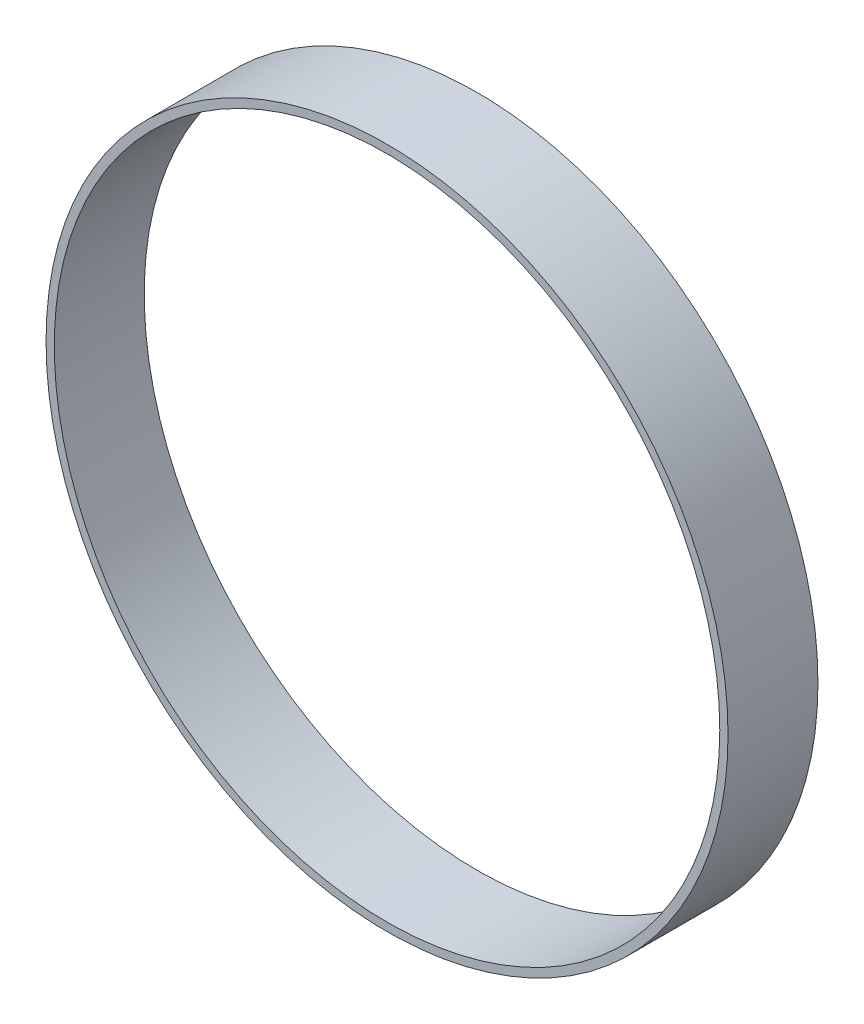
ISO-10303-21;
HEADER;
FILE_DESCRIPTION(('STEP AP214'),'2;1');
FILE_NAME('part.step','',(''),(''),'','','');
FILE_SCHEMA(('AUTOMOTIVE_DESIGN { 1 0 10303 214 1 1 1 1 }'));
ENDSEC;
DATA;
#1=APPLICATION_CONTEXT('core data for automotive mechanical design processes');
#2=APPLICATION_PROTOCOL_DEFINITION('international standard','automotive_design',2000,#1);
#3=PRODUCT_CONTEXT('',#1,'mechanical');
#4=PRODUCT('Part','Part','',(#3));
#5=PRODUCT_RELATED_PRODUCT_CATEGORY('part','',(#4));
#6=PRODUCT_DEFINITION_FORMATION('','',#4);
#7=PRODUCT_DEFINITION_CONTEXT('part definition',#1,'design');
#8=PRODUCT_DEFINITION('design','',#6,#7);
#9=PRODUCT_DEFINITION_SHAPE('','',#8);
#10=(LENGTH_UNIT() NAMED_UNIT(*) SI_UNIT(.MILLI.,.METRE.));
#11=(NAMED_UNIT(*) PLANE_ANGLE_UNIT() SI_UNIT($,.RADIAN.));
#12=(NAMED_UNIT(*) SI_UNIT($,.STERADIAN.) SOLID_ANGLE_UNIT());
#13=UNCERTAINTY_MEASURE_WITH_UNIT(LENGTH_MEASURE(1.E-05),#10,'distance_accuracy_value','');
#14=(GEOMETRIC_REPRESENTATION_CONTEXT(3) GLOBAL_UNCERTAINTY_ASSIGNED_CONTEXT((#13)) GLOBAL_UNIT_ASSIGNED_CONTEXT((#10,
#11,#12)) REPRESENTATION_CONTEXT('',''));
#15=CARTESIAN_POINT('',(0.,0.,0.));
#16=DIRECTION('',(0.,0.,1.));
#17=DIRECTION('',(1.,0.,0.));
#18=AXIS2_PLACEMENT_3D('',#15,#16,#17);
#19=CARTESIAN_POINT('',(0.,0.,12.));
#20=DIRECTION('',(0.,0.,1.));
#21=DIRECTION('',(1.,0.,0.));
#22=AXIS2_PLACEMENT_3D('',#19,#20,#21);
#23=PLANE('',#22);
#24=CARTESIAN_POINT('',(0.,0.,12.));
#25=DIRECTION('',(0.,0.,1.));
#26=DIRECTION('',(1.,0.,0.));
#27=AXIS2_PLACEMENT_3D('',#24,#25,#26);
#28=CIRCLE('',#27,45.5);
#29=CARTESIAN_POINT('',(45.5,0.,12.));
#30=VERTEX_POINT('',#29);
#31=EDGE_CURVE('E10',#30,#30,#28,.T.);
#32=ORIENTED_EDGE('',*,*,#31,.T.);
#33=EDGE_LOOP('',(#32));
#34=FACE_BOUND('',#33,.T.);
#35=CARTESIAN_POINT('',(0.,0.,12.));
#36=DIRECTION('',(0.,0.,1.));
#37=DIRECTION('',(1.,0.,0.));
#38=AXIS2_PLACEMENT_3D('',#35,#36,#37);
#39=CIRCLE('',#38,44.4);
#40=CARTESIAN_POINT('',(44.4,0.,12.));
#41=VERTEX_POINT('',#40);
#42=EDGE_CURVE('E50',#41,#41,#39,.T.);
#43=ORIENTED_EDGE('',*,*,#42,.F.);
#44=EDGE_LOOP('',(#43));
#45=FACE_BOUND('',#44,.T.);
#46=ADVANCED_FACE('F39',(#34,#45),#23,.T.);
#47=CARTESIAN_POINT('',(0.,0.,0.));
#48=DIRECTION('',(0.,0.,1.));
#49=DIRECTION('',(1.,0.,0.));
#50=AXIS2_PLACEMENT_3D('',#47,#48,#49);
#51=PLANE('',#50);
#52=CARTESIAN_POINT('',(0.,0.,0.));
#53=DIRECTION('',(0.,0.,1.));
#54=DIRECTION('',(1.,0.,0.));
#55=AXIS2_PLACEMENT_3D('',#52,#53,#54);
#56=CIRCLE('',#55,45.5);
#57=CARTESIAN_POINT('',(45.5,0.,0.));
#58=VERTEX_POINT('',#57);
#59=EDGE_CURVE('E43',#58,#58,#56,.T.);
#60=ORIENTED_EDGE('',*,*,#59,.F.);
#61=EDGE_LOOP('',(#60));
#62=FACE_BOUND('',#61,.T.);
#63=CARTESIAN_POINT('',(0.,0.,0.));
#64=DIRECTION('',(0.,0.,1.));
#65=DIRECTION('',(1.,0.,0.));
#66=AXIS2_PLACEMENT_3D('',#63,#64,#65);
#67=CIRCLE('',#66,44.4);
#68=CARTESIAN_POINT('',(44.4,0.,0.));
#69=VERTEX_POINT('',#68);
#70=EDGE_CURVE('E52',#69,#69,#67,.T.);
#71=ORIENTED_EDGE('',*,*,#70,.T.);
#72=EDGE_LOOP('',(#71));
#73=FACE_BOUND('',#72,.T.);
#74=ADVANCED_FACE('F62',(#62,#73),#51,.F.);
#75=CARTESIAN_POINT('',(0.,0.,12.));
#76=DIRECTION('',(0.,0.,-1.));
#77=DIRECTION('',(-1.,0.,0.));
#78=AXIS2_PLACEMENT_3D('',#75,#76,#77);
#79=CYLINDRICAL_SURFACE('',#78,45.5);
#80=ORIENTED_EDGE('',*,*,#31,.F.);
#81=EDGE_LOOP('',(#80));
#82=FACE_BOUND('',#81,.T.);
#83=ORIENTED_EDGE('',*,*,#59,.T.);
#84=EDGE_LOOP('',(#83));
#85=FACE_BOUND('',#84,.T.);
#86=ADVANCED_FACE('F41',(#82,#85),#79,.T.);
#87=CARTESIAN_POINT('',(0.,0.,12.));
#88=DIRECTION('',(0.,0.,-1.));
#89=DIRECTION('',(-1.,0.,0.));
#90=AXIS2_PLACEMENT_3D('',#87,#88,#89);
#91=CYLINDRICAL_SURFACE('',#90,44.4);
#92=ORIENTED_EDGE('',*,*,#42,.T.);
#93=EDGE_LOOP('',(#92));
#94=FACE_BOUND('',#93,.T.);
#95=ORIENTED_EDGE('',*,*,#70,.F.);
#96=EDGE_LOOP('',(#95));
#97=FACE_BOUND('',#96,.T.);
#98=ADVANCED_FACE('F58',(#94,#97),#91,.F.);
#99=CLOSED_SHELL('',(#46,#74,#86,#98));
#100=MANIFOLD_SOLID_BREP('B2',#99);
#101=ADVANCED_BREP_SHAPE_REPRESENTATION('',(#18,#100),#14);
#102=SHAPE_DEFINITION_REPRESENTATION(#9,#101);
ENDSEC;
END-ISO-10303-21;
